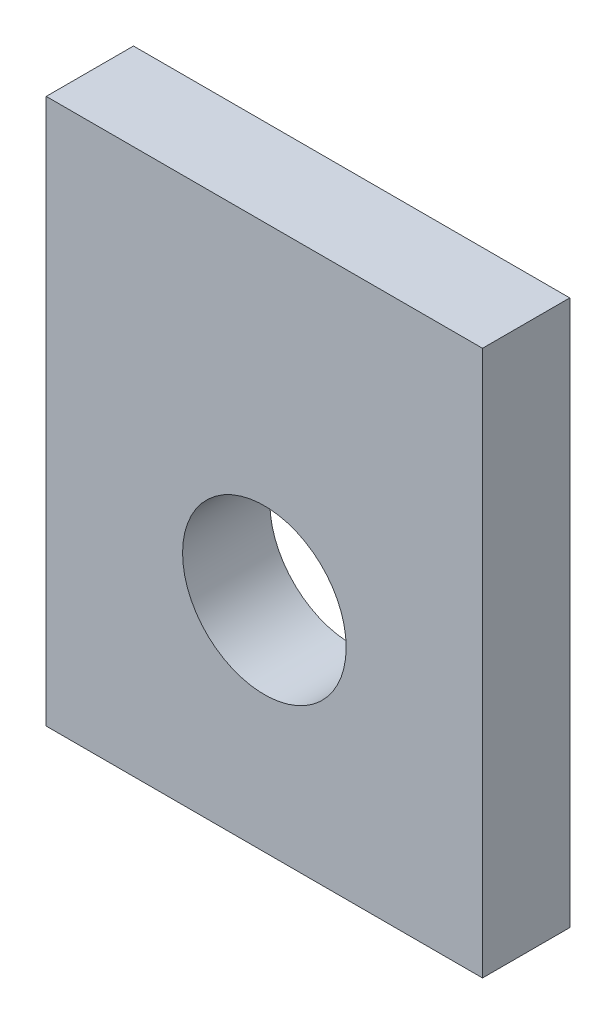
ISO-10303-21;
HEADER;
FILE_DESCRIPTION(('STEP AP214'),'2;1');
FILE_NAME('part.step','',(''),(''),'','','');
FILE_SCHEMA(('AUTOMOTIVE_DESIGN { 1 0 10303 214 1 1 1 1 }'));
ENDSEC;
DATA;
#1=APPLICATION_CONTEXT('core data for automotive mechanical design processes');
#2=APPLICATION_PROTOCOL_DEFINITION('international standard','automotive_design',2000,#1);
#3=PRODUCT_CONTEXT('',#1,'mechanical');
#4=PRODUCT('Part','Part','',(#3));
#5=PRODUCT_RELATED_PRODUCT_CATEGORY('part','',(#4));
#6=PRODUCT_DEFINITION_FORMATION('','',#4);
#7=PRODUCT_DEFINITION_CONTEXT('part definition',#1,'design');
#8=PRODUCT_DEFINITION('design','',#6,#7);
#9=PRODUCT_DEFINITION_SHAPE('','',#8);
#10=(LENGTH_UNIT() NAMED_UNIT(*) SI_UNIT(.MILLI.,.METRE.));
#11=(NAMED_UNIT(*) PLANE_ANGLE_UNIT() SI_UNIT($,.RADIAN.));
#12=(NAMED_UNIT(*) SI_UNIT($,.STERADIAN.) SOLID_ANGLE_UNIT());
#13=UNCERTAINTY_MEASURE_WITH_UNIT(LENGTH_MEASURE(1.E-05),#10,'distance_accuracy_value','');
#14=(GEOMETRIC_REPRESENTATION_CONTEXT(3) GLOBAL_UNCERTAINTY_ASSIGNED_CONTEXT((#13)) GLOBAL_UNIT_ASSIGNED_CONTEXT((#10,
#11,#12)) REPRESENTATION_CONTEXT('',''));
#15=CARTESIAN_POINT('',(0.,0.,0.));
#16=DIRECTION('',(0.,0.,1.));
#17=DIRECTION('',(1.,0.,0.));
#18=AXIS2_PLACEMENT_3D('',#15,#16,#17);
#19=CARTESIAN_POINT('',(0.,0.,8.));
#20=DIRECTION('',(0.,0.,-1.));
#21=DIRECTION('',(-1.,0.,0.));
#22=AXIS2_PLACEMENT_3D('',#19,#20,#21);
#23=PLANE('',#22);
#24=DIRECTION('',(0.,1.,0.));
#25=VECTOR('',#24,1.);
#26=CARTESIAN_POINT('',(26.7272727272727,21.9090909090909,8.));
#27=LINE('',#26,#25);
#28=CARTESIAN_POINT('',(26.7272727272727,-28.0909090909091,8.));
#29=VERTEX_POINT('',#28);
#30=CARTESIAN_POINT('',(26.7272727272727,21.9090909090909,8.));
#31=VERTEX_POINT('',#30);
#32=EDGE_CURVE('E86',#29,#31,#27,.T.);
#33=ORIENTED_EDGE('',*,*,#32,.T.);
#34=DIRECTION('',(-1.,0.,0.));
#35=VECTOR('',#34,1.);
#36=CARTESIAN_POINT('',(26.7272727272727,21.9090909090909,8.));
#37=LINE('',#36,#35);
#38=CARTESIAN_POINT('',(-13.2727272727273,21.9090909090909,8.));
#39=VERTEX_POINT('',#38);
#40=EDGE_CURVE('E81',#31,#39,#37,.T.);
#41=ORIENTED_EDGE('',*,*,#40,.T.);
#42=DIRECTION('',(0.,-1.,0.));
#43=VECTOR('',#42,1.);
#44=CARTESIAN_POINT('',(-13.2727272727273,21.9090909090909,8.));
#45=LINE('',#44,#43);
#46=CARTESIAN_POINT('',(-13.2727272727273,-28.0909090909091,8.));
#47=VERTEX_POINT('',#46);
#48=EDGE_CURVE('E84',#39,#47,#45,.T.);
#49=ORIENTED_EDGE('',*,*,#48,.T.);
#50=DIRECTION('',(1.,0.,0.));
#51=VECTOR('',#50,1.);
#52=CARTESIAN_POINT('',(26.7272727272727,-28.0909090909091,8.));
#53=LINE('',#52,#51);
#54=EDGE_CURVE('E51',#47,#29,#53,.T.);
#55=ORIENTED_EDGE('',*,*,#54,.T.);
#56=EDGE_LOOP('',(#33,#41,#49,#55));
#57=FACE_BOUND('',#56,.T.);
#58=CARTESIAN_POINT('',(6.72727272727274,-8.09090909090909,8.));
#59=DIRECTION('',(0.,0.,1.));
#60=DIRECTION('',(1.,0.,0.));
#61=AXIS2_PLACEMENT_3D('',#58,#59,#60);
#62=CIRCLE('',#61,7.5);
#63=CARTESIAN_POINT('',(14.2272727272727,-8.09090909090909,8.));
#64=VERTEX_POINT('',#63);
#65=EDGE_CURVE('E101',#64,#64,#62,.T.);
#66=ORIENTED_EDGE('',*,*,#65,.F.);
#67=EDGE_LOOP('',(#66));
#68=FACE_BOUND('',#67,.T.);
#69=ADVANCED_FACE('F34',(#57,#68),#23,.F.);
#70=CARTESIAN_POINT('',(0.,0.,0.));
#71=DIRECTION('',(0.,0.,-1.));
#72=DIRECTION('',(-1.,0.,0.));
#73=AXIS2_PLACEMENT_3D('',#70,#71,#72);
#74=PLANE('',#73);
#75=DIRECTION('',(0.,1.,0.));
#76=VECTOR('',#75,1.);
#77=CARTESIAN_POINT('',(26.7272727272727,21.9090909090909,0.));
#78=LINE('',#77,#76);
#79=CARTESIAN_POINT('',(26.7272727272727,-28.0909090909091,0.));
#80=VERTEX_POINT('',#79);
#81=CARTESIAN_POINT('',(26.7272727272727,21.9090909090909,0.));
#82=VERTEX_POINT('',#81);
#83=EDGE_CURVE('E98',#80,#82,#78,.T.);
#84=ORIENTED_EDGE('',*,*,#83,.F.);
#85=DIRECTION('',(1.,0.,0.));
#86=VECTOR('',#85,1.);
#87=CARTESIAN_POINT('',(26.7272727272727,-28.0909090909091,0.));
#88=LINE('',#87,#86);
#89=CARTESIAN_POINT('',(-13.2727272727273,-28.0909090909091,0.));
#90=VERTEX_POINT('',#89);
#91=EDGE_CURVE('E74',#90,#80,#88,.T.);
#92=ORIENTED_EDGE('',*,*,#91,.F.);
#93=DIRECTION('',(0.,-1.,0.));
#94=VECTOR('',#93,1.);
#95=CARTESIAN_POINT('',(-13.2727272727273,21.9090909090909,0.));
#96=LINE('',#95,#94);
#97=CARTESIAN_POINT('',(-13.2727272727273,21.9090909090909,0.));
#98=VERTEX_POINT('',#97);
#99=EDGE_CURVE('E68',#98,#90,#96,.T.);
#100=ORIENTED_EDGE('',*,*,#99,.F.);
#101=DIRECTION('',(-1.,0.,0.));
#102=VECTOR('',#101,1.);
#103=CARTESIAN_POINT('',(26.7272727272727,21.9090909090909,0.));
#104=LINE('',#103,#102);
#105=EDGE_CURVE('E90',#82,#98,#104,.T.);
#106=ORIENTED_EDGE('',*,*,#105,.F.);
#107=EDGE_LOOP('',(#84,#92,#100,#106));
#108=FACE_BOUND('',#107,.T.);
#109=CARTESIAN_POINT('',(6.72727272727274,-8.09090909090909,0.));
#110=DIRECTION('',(0.,0.,1.));
#111=DIRECTION('',(1.,0.,0.));
#112=AXIS2_PLACEMENT_3D('',#109,#110,#111);
#113=CIRCLE('',#112,7.5);
#114=CARTESIAN_POINT('',(14.2272727272727,-8.09090909090909,0.));
#115=VERTEX_POINT('',#114);
#116=EDGE_CURVE('E113',#115,#115,#113,.T.);
#117=ORIENTED_EDGE('',*,*,#116,.T.);
#118=EDGE_LOOP('',(#117));
#119=FACE_BOUND('',#118,.T.);
#120=ADVANCED_FACE('F109',(#108,#119),#74,.T.);
#121=CARTESIAN_POINT('',(26.7272727272727,21.9090909090909,8.));
#122=DIRECTION('',(-1.,0.,0.));
#123=DIRECTION('',(0.,0.,1.));
#124=AXIS2_PLACEMENT_3D('',#121,#122,#123);
#125=PLANE('',#124);
#126=ORIENTED_EDGE('',*,*,#83,.T.);
#127=DIRECTION('',(0.,0.,-1.));
#128=VECTOR('',#127,1.);
#129=CARTESIAN_POINT('',(26.7272727272727,21.9090909090909,8.));
#130=LINE('',#129,#128);
#131=EDGE_CURVE('E11',#31,#82,#130,.T.);
#132=ORIENTED_EDGE('',*,*,#131,.F.);
#133=ORIENTED_EDGE('',*,*,#32,.F.);
#134=DIRECTION('',(0.,0.,-1.));
#135=VECTOR('',#134,1.);
#136=CARTESIAN_POINT('',(26.7272727272727,-28.0909090909091,8.));
#137=LINE('',#136,#135);
#138=EDGE_CURVE('E94',#29,#80,#137,.T.);
#139=ORIENTED_EDGE('',*,*,#138,.T.);
#140=EDGE_LOOP('',(#126,#132,#133,#139));
#141=FACE_BOUND('',#140,.T.);
#142=ADVANCED_FACE('F36',(#141),#125,.F.);
#143=CARTESIAN_POINT('',(26.7272727272727,21.9090909090909,8.));
#144=DIRECTION('',(0.,-1.,0.));
#145=DIRECTION('',(1.,0.,0.));
#146=AXIS2_PLACEMENT_3D('',#143,#144,#145);
#147=PLANE('',#146);
#148=ORIENTED_EDGE('',*,*,#105,.T.);
#149=DIRECTION('',(0.,0.,-1.));
#150=VECTOR('',#149,1.);
#151=CARTESIAN_POINT('',(-13.2727272727273,21.9090909090909,8.));
#152=LINE('',#151,#150);
#153=EDGE_CURVE('E43',#39,#98,#152,.T.);
#154=ORIENTED_EDGE('',*,*,#153,.F.);
#155=ORIENTED_EDGE('',*,*,#40,.F.);
#156=ORIENTED_EDGE('',*,*,#131,.T.);
#157=EDGE_LOOP('',(#148,#154,#155,#156));
#158=FACE_BOUND('',#157,.T.);
#159=ADVANCED_FACE('F89',(#158),#147,.F.);
#160=CARTESIAN_POINT('',(-13.2727272727273,21.9090909090909,8.));
#161=DIRECTION('',(1.,0.,0.));
#162=DIRECTION('',(0.,1.,0.));
#163=AXIS2_PLACEMENT_3D('',#160,#161,#162);
#164=PLANE('',#163);
#165=ORIENTED_EDGE('',*,*,#99,.T.);
#166=DIRECTION('',(0.,0.,-1.));
#167=VECTOR('',#166,1.);
#168=CARTESIAN_POINT('',(-13.2727272727273,-28.0909090909091,8.));
#169=LINE('',#168,#167);
#170=EDGE_CURVE('E91',#47,#90,#169,.T.);
#171=ORIENTED_EDGE('',*,*,#170,.F.);
#172=ORIENTED_EDGE('',*,*,#48,.F.);
#173=ORIENTED_EDGE('',*,*,#153,.T.);
#174=EDGE_LOOP('',(#165,#171,#172,#173));
#175=FACE_BOUND('',#174,.T.);
#176=ADVANCED_FACE('F92',(#175),#164,.F.);
#177=CARTESIAN_POINT('',(26.7272727272727,-28.0909090909091,8.));
#178=DIRECTION('',(0.,1.,0.));
#179=DIRECTION('',(0.,0.,1.));
#180=AXIS2_PLACEMENT_3D('',#177,#178,#179);
#181=PLANE('',#180);
#182=ORIENTED_EDGE('',*,*,#91,.T.);
#183=ORIENTED_EDGE('',*,*,#138,.F.);
#184=ORIENTED_EDGE('',*,*,#54,.F.);
#185=ORIENTED_EDGE('',*,*,#170,.T.);
#186=EDGE_LOOP('',(#182,#183,#184,#185));
#187=FACE_BOUND('',#186,.T.);
#188=ADVANCED_FACE('F106',(#187),#181,.F.);
#189=CARTESIAN_POINT('',(6.72727272727274,-8.09090909090909,8.));
#190=DIRECTION('',(0.,0.,-1.));
#191=DIRECTION('',(-1.,0.,0.));
#192=AXIS2_PLACEMENT_3D('',#189,#190,#191);
#193=CYLINDRICAL_SURFACE('',#192,7.5);
#194=ORIENTED_EDGE('',*,*,#65,.T.);
#195=EDGE_LOOP('',(#194));
#196=FACE_BOUND('',#195,.T.);
#197=ORIENTED_EDGE('',*,*,#116,.F.);
#198=EDGE_LOOP('',(#197));
#199=FACE_BOUND('',#198,.T.);
#200=ADVANCED_FACE('F119',(#196,#199),#193,.F.);
#201=CLOSED_SHELL('',(#69,#120,#142,#159,#176,#188,#200));
#202=MANIFOLD_SOLID_BREP('B2',#201);
#203=ADVANCED_BREP_SHAPE_REPRESENTATION('',(#18,#202),#14);
#204=SHAPE_DEFINITION_REPRESENTATION(#9,#203);
ENDSEC;
END-ISO-10303-21;
